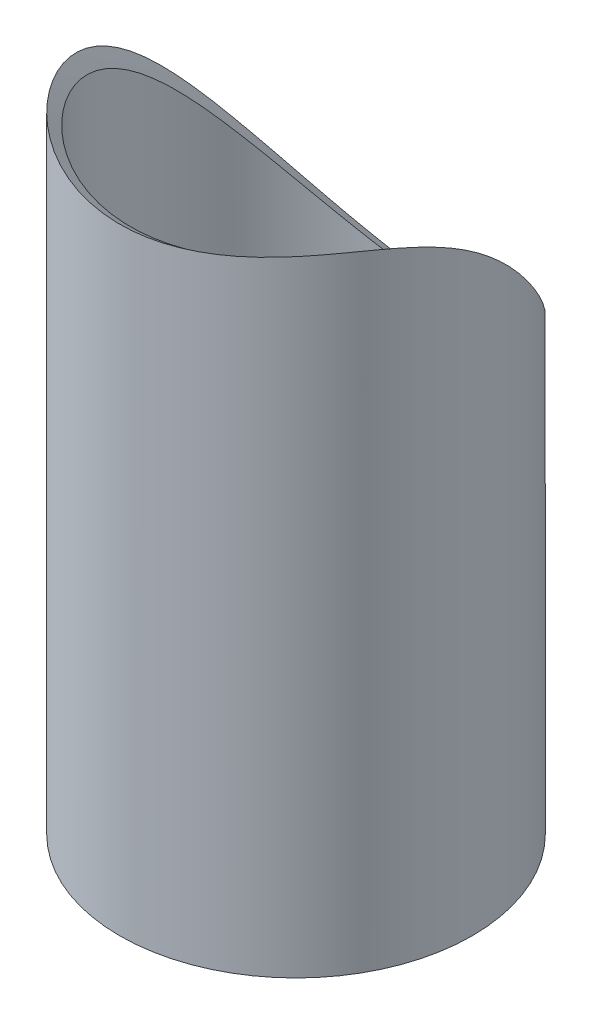
ISO-10303-21;
HEADER;
FILE_DESCRIPTION(('STEP AP214'),'2;1');
FILE_NAME('part.step','',(''),(''),'','','');
FILE_SCHEMA(('AUTOMOTIVE_DESIGN { 1 0 10303 214 1 1 1 1 }'));
ENDSEC;
DATA;
#1=APPLICATION_CONTEXT('core data for automotive mechanical design processes');
#2=APPLICATION_PROTOCOL_DEFINITION('international standard','automotive_design',2000,#1);
#3=PRODUCT_CONTEXT('',#1,'mechanical');
#4=PRODUCT('Part','Part','',(#3));
#5=PRODUCT_RELATED_PRODUCT_CATEGORY('part','',(#4));
#6=PRODUCT_DEFINITION_FORMATION('','',#4);
#7=PRODUCT_DEFINITION_CONTEXT('part definition',#1,'design');
#8=PRODUCT_DEFINITION('design','',#6,#7);
#9=PRODUCT_DEFINITION_SHAPE('','',#8);
#10=(LENGTH_UNIT() NAMED_UNIT(*) SI_UNIT(.MILLI.,.METRE.));
#11=(NAMED_UNIT(*) PLANE_ANGLE_UNIT() SI_UNIT($,.RADIAN.));
#12=(NAMED_UNIT(*) SI_UNIT($,.STERADIAN.) SOLID_ANGLE_UNIT());
#13=UNCERTAINTY_MEASURE_WITH_UNIT(LENGTH_MEASURE(1.E-05),#10,'distance_accuracy_value','');
#14=(GEOMETRIC_REPRESENTATION_CONTEXT(3) GLOBAL_UNCERTAINTY_ASSIGNED_CONTEXT((#13)) GLOBAL_UNIT_ASSIGNED_CONTEXT((#10,
#11,#12)) REPRESENTATION_CONTEXT('',''));
#15=CARTESIAN_POINT('',(0.,0.,0.));
#16=DIRECTION('',(0.,0.,1.));
#17=DIRECTION('',(1.,0.,0.));
#18=AXIS2_PLACEMENT_3D('',#15,#16,#17);
#19=CARTESIAN_POINT('',(0.,0.,0.));
#20=DIRECTION('',(0.,1.,0.));
#21=DIRECTION('',(0.,0.,1.));
#22=AXIS2_PLACEMENT_3D('',#19,#20,#21);
#23=PLANE('',#22);
#24=CARTESIAN_POINT('',(0.,0.,0.));
#25=DIRECTION('',(0.,1.,0.));
#26=DIRECTION('',(0.,0.,1.));
#27=AXIS2_PLACEMENT_3D('',#24,#25,#26);
#28=CIRCLE('',#27,50.);
#29=CARTESIAN_POINT('',(0.,0.,50.));
#30=VERTEX_POINT('',#29);
#31=EDGE_CURVE('E57',#30,#30,#28,.T.);
#32=ORIENTED_EDGE('',*,*,#31,.F.);
#33=EDGE_LOOP('',(#32));
#34=FACE_BOUND('',#33,.T.);
#35=CARTESIAN_POINT('',(0.,0.,0.));
#36=DIRECTION('',(0.,1.,0.));
#37=DIRECTION('',(1.,0.,0.));
#38=AXIS2_PLACEMENT_3D('',#35,#36,#37);
#39=CIRCLE('',#38,47.);
#40=CARTESIAN_POINT('',(47.,0.,0.));
#41=VERTEX_POINT('',#40);
#42=EDGE_CURVE('E91',#41,#41,#39,.T.);
#43=ORIENTED_EDGE('',*,*,#42,.T.);
#44=EDGE_LOOP('',(#43));
#45=FACE_BOUND('',#44,.T.);
#46=ADVANCED_FACE('F78',(#34,#45),#23,.F.);
#47=CARTESIAN_POINT('',(0.,200.,0.));
#48=DIRECTION('',(0.,-1.,0.));
#49=DIRECTION('',(0.,0.,-1.));
#50=AXIS2_PLACEMENT_3D('',#47,#48,#49);
#51=CYLINDRICAL_SURFACE('',#50,50.);
#52=CARTESIAN_POINT('',(0.,104.768313502701,-50.));
#53=CARTESIAN_POINT('',(0.78644238222769,104.768323416378,-49.9999941940866));
#54=CARTESIAN_POINT('',(1.57299880706585,104.798674878486,-49.9813998599408));
#55=CARTESIAN_POINT('',(3.13980000116847,104.919277034445,-49.9074860459622));
#56=CARTESIAN_POINT('',(3.92004367269452,105.009537928725,-49.8521603120879));
#57=CARTESIAN_POINT('',(5.46909188235895,105.247695586177,-49.7060846207518));
#58=CARTESIAN_POINT('',(6.23788401859229,105.395650700994,-49.6152987989814));
#59=CARTESIAN_POINT('',(7.75825219849875,105.745559887175,-49.4003977902167));
#60=CARTESIAN_POINT('',(8.50982691946527,105.947518092258,-49.2762800517964));
#61=CARTESIAN_POINT('',(10.1658076825802,106.45424029591,-48.9645049276828));
#62=CARTESIAN_POINT('',(11.0647236930401,106.772006508497,-48.7687727683172));
#63=CARTESIAN_POINT('',(12.8256737908742,107.474068355606,-48.3355469525679));
#64=CARTESIAN_POINT('',(13.6876984445727,107.858380881737,-48.0980426928306));
#65=CARTESIAN_POINT('',(15.3734294298292,108.685032507887,-47.5860774544873));
#66=CARTESIAN_POINT('',(16.1970809646406,109.127451338698,-47.3115656819318));
#67=CARTESIAN_POINT('',(17.8039756618006,110.061462662947,-46.7305958644128));
#68=CARTESIAN_POINT('',(18.5872167912487,110.553057626608,-46.4241362146058));
#69=CARTESIAN_POINT('',(20.5412788037415,111.864981742934,-45.6039898156328));
#70=CARTESIAN_POINT('',(21.6837223730409,112.715329560634,-45.0703054208032));
#71=CARTESIAN_POINT('',(23.3280852338497,114.049241024074,-44.2287204671817));
#72=CARTESIAN_POINT('',(23.8648598693699,114.503806476247,-43.9412238585591));
#73=CARTESIAN_POINT('',(24.916264956925,115.430193475675,-43.3536892846687));
#74=CARTESIAN_POINT('',(25.4308961117635,115.902014474383,-43.0536517180302));
#75=CARTESIAN_POINT('',(26.4398571644732,116.861736873403,-42.4415233286623));
#76=CARTESIAN_POINT('',(26.9341426893225,117.34966962927,-42.1294087718115));
#77=CARTESIAN_POINT('',(27.9021514252759,118.338827640416,-41.4946359030229));
#78=CARTESIAN_POINT('',(28.3758747001439,118.840052854468,-41.1719776237868));
#79=CARTESIAN_POINT('',(29.7673762288457,120.361036349416,-40.1894724351253));
#80=CARTESIAN_POINT('',(30.6557544971384,121.398360400577,-39.5149309502329));
#81=CARTESIAN_POINT('',(32.267355209026,123.393698816843,-38.2069877615529));
#82=CARTESIAN_POINT('',(32.9980296678332,124.348058584286,-37.5770979461477));
#83=CARTESIAN_POINT('',(34.4061154304464,126.279195666192,-36.2922544512599));
#84=CARTESIAN_POINT('',(35.0835181862315,127.255976546011,-35.6372967743331));
#85=CARTESIAN_POINT('',(36.3888271305669,129.227355675981,-34.3034199457652));
#86=CARTESIAN_POINT('',(37.0166967439963,130.221966438789,-33.624483614076));
#87=CARTESIAN_POINT('',(38.2252724438045,132.223860092923,-32.243916038181));
#88=CARTESIAN_POINT('',(38.805980912297,133.231142341238,-31.5422859427454));
#89=CARTESIAN_POINT('',(39.9235775747383,135.256207694511,-30.1152896076343));
#90=CARTESIAN_POINT('',(40.4603898919546,136.274005694099,-29.3898851822589));
#91=CARTESIAN_POINT('',(41.4909571416998,138.31477915309,-27.9161068200627));
#92=CARTESIAN_POINT('',(41.9847110441677,139.337754735734,-27.1677323343214));
#93=CARTESIAN_POINT('',(42.93022618356,141.384785045508,-25.647544203908));
#94=CARTESIAN_POINT('',(43.3820081177901,142.408838986198,-24.8757423635863));
#95=CARTESIAN_POINT('',(44.244611638993,144.454883271958,-23.3069880488496));
#96=CARTESIAN_POINT('',(44.6554351453077,145.476873711524,-22.5100367552627));
#97=CARTESIAN_POINT('',(45.3330936028251,147.245576357505,-21.1032800347636));
#98=CARTESIAN_POINT('',(45.6092872491557,147.993655379556,-20.4996813447217));
#99=CARTESIAN_POINT('',(46.1394258165705,149.484905204405,-19.2768651466702));
#100=CARTESIAN_POINT('',(46.3933713435424,150.228076140357,-18.6576480645913));
#101=CARTESIAN_POINT('',(46.8786929381629,151.707813934953,-17.4023300919932));
#102=CARTESIAN_POINT('',(47.1100639848603,152.444379291472,-16.7662254852389));
#103=CARTESIAN_POINT('',(47.5495384155535,153.908625715036,-15.4759778110281));
#104=CARTESIAN_POINT('',(47.7576418383881,154.636306796909,-14.821834773684));
#105=CARTESIAN_POINT('',(48.1491354604275,156.078450084046,-13.4958288202867));
#106=CARTESIAN_POINT('',(48.3325897176485,156.792942220841,-12.8240174819972));
#107=CARTESIAN_POINT('',(48.6741832301573,158.207924765098,-11.4594337195789));
#108=CARTESIAN_POINT('',(48.8323215737184,158.908414667489,-10.766660541599));
#109=CARTESIAN_POINT('',(49.12156041996,160.291789736738,-9.35887056857692));
#110=CARTESIAN_POINT('',(49.2526740706821,160.974683322373,-8.64386478592711));
#111=CARTESIAN_POINT('',(49.4858502039919,162.319328035733,-7.18976474370322));
#112=CARTESIAN_POINT('',(49.5879164604444,162.981081900024,-6.45067362723683));
#113=CARTESIAN_POINT('',(49.7776253859829,164.408395103356,-4.79707663528279));
#114=CARTESIAN_POINT('',(49.8583541804008,165.168400819202,-3.87693554055328));
#115=CARTESIAN_POINT('',(49.9689298463217,166.642987363244,-1.99787202324259));
#116=CARTESIAN_POINT('',(49.9987811009452,167.357572099369,-1.03895294868721));
#117=CARTESIAN_POINT('',(50.0011442514139,168.730378993094,0.916758945400916));
#118=CARTESIAN_POINT('',(49.9737355124778,169.388677849226,1.91349746508791));
#119=CARTESIAN_POINT('',(49.8545476273544,170.639409855306,3.94430804836693));
#120=CARTESIAN_POINT('',(49.7627700012893,171.231844560307,4.97837922977168));
#121=CARTESIAN_POINT('',(49.5706476449647,172.067225140827,6.56039036024081));
#122=CARTESIAN_POINT('',(49.4968106054728,172.338531274332,7.09678338322794));
#123=CARTESIAN_POINT('',(49.3299304388253,172.860463778808,8.17656774219508));
#124=CARTESIAN_POINT('',(49.2368898577681,173.111092885078,8.71995814148326));
#125=CARTESIAN_POINT('',(49.0308423822749,173.590781048187,9.81252146609589));
#126=CARTESIAN_POINT('',(48.9178332571782,173.819837690806,10.3616950309983));
#127=CARTESIAN_POINT('',(48.6712616285553,174.25567127206,11.4641740101017));
#128=CARTESIAN_POINT('',(48.5377019420835,174.462451257767,12.0174788481147));
#129=CARTESIAN_POINT('',(48.2495879450917,174.85338864461,13.1265167832008));
#130=CARTESIAN_POINT('',(48.095036701003,175.037549342487,13.6822495141545));
#131=CARTESIAN_POINT('',(47.7646711847235,175.383250170475,14.7943444547096));
#132=CARTESIAN_POINT('',(47.5888595835553,175.54479313665,15.3507065765556));
#133=CARTESIAN_POINT('',(47.2158493607762,175.84561547736,16.4622964564549));
#134=CARTESIAN_POINT('',(47.0186503376748,175.984894433827,17.0175241930137));
#135=CARTESIAN_POINT('',(46.6029676586262,176.241826878212,18.1249379253767));
#136=CARTESIAN_POINT('',(46.3844847182881,176.359481092814,18.6771240227878));
#137=CARTESIAN_POINT('',(45.7692756359582,176.647687036874,20.1539272086032));
#138=CARTESIAN_POINT('',(45.3530625174084,176.799185064727,21.0742683892661));
#139=CARTESIAN_POINT('',(44.4625454879853,177.049087467995,22.8934079021995));
#140=CARTESIAN_POINT('',(43.9882492295746,177.147498828371,23.7922090537551));
#141=CARTESIAN_POINT('',(42.9835833145057,177.29830321309,25.5626320901249));
#142=CARTESIAN_POINT('',(42.4531757586522,177.350664908952,26.4342350832738));
#143=CARTESIAN_POINT('',(41.3392967526718,177.416571931778,28.1443463429662));
#144=CARTESIAN_POINT('',(40.7558204608187,177.430113713335,28.9828515798081));
#145=CARTESIAN_POINT('',(39.4737384061696,177.425313176416,30.7099429819318));
#146=CARTESIAN_POINT('',(38.7694908394659,177.403415776895,31.5943306570423));
#147=CARTESIAN_POINT('',(37.3034164448908,177.329937937142,33.3126241115287));
#148=CARTESIAN_POINT('',(36.5415873747536,177.278356340468,34.1465279227466));
#149=CARTESIAN_POINT('',(34.9639493619514,177.153636567004,35.7602544095779));
#150=CARTESIAN_POINT('',(34.1481266090835,177.080492858524,36.5400631437788));
#151=CARTESIAN_POINT('',(32.4664267259583,176.919821660123,38.0421149151229));
#152=CARTESIAN_POINT('',(31.60054603667,176.832293146649,38.7643538504493));
#153=CARTESIAN_POINT('',(29.65166029704,176.631513961297,40.2812906777648));
#154=CARTESIAN_POINT('',(28.5588937880823,176.51655173702,41.0632643681767));
#155=CARTESIAN_POINT('',(26.3141112161232,176.284119217378,42.5366956908951));
#156=CARTESIAN_POINT('',(25.1620888616301,176.166648656467,43.2281436838854));
#157=CARTESIAN_POINT('',(22.8053152892469,175.936669947439,44.5165321610105));
#158=CARTESIAN_POINT('',(21.6005455719782,175.824163568572,45.1134391435934));
#159=CARTESIAN_POINT('',(19.1460230272705,175.610350898653,46.2086126696836));
#160=CARTESIAN_POINT('',(17.8962702924635,175.509044584539,46.7068794163038));
#161=CARTESIAN_POINT('',(15.2977580704952,175.318082204911,47.6231833684529));
#162=CARTESIAN_POINT('',(13.9471406935507,175.229233501675,48.0361332887338));
#163=CARTESIAN_POINT('',(11.2145492849393,175.073783031109,48.7465581257543));
#164=CARTESIAN_POINT('',(9.83257394881359,175.007182191086,49.0440282292974));
#165=CARTESIAN_POINT('',(7.04757570893721,174.899376356198,49.5209784800099));
#166=CARTESIAN_POINT('',(5.64455523090232,174.858168457173,49.7004721201651));
#167=CARTESIAN_POINT('',(2.82784386673616,174.803016329642,49.9399737516603));
#168=CARTESIAN_POINT('',(1.41415330073316,174.789071286422,49.9999853135583));
#169=CARTESIAN_POINT('',(-1.37943340809569,174.78906345661,50.0000143311629));
#170=CARTESIAN_POINT('',(-2.75933038796572,174.802342785464,49.942863060791));
#171=CARTESIAN_POINT('',(-5.50916269485833,174.854897219719,49.7147107715116));
#172=CARTESIAN_POINT('',(-6.87909816177829,174.89417195933,49.5437113545972));
#173=CARTESIAN_POINT('',(-9.59910853726493,174.997008786971,49.0892887215205));
#174=CARTESIAN_POINT('',(-10.9491853650649,175.060568511755,48.8058764444954));
#175=CARTESIAN_POINT('',(-13.6202173918657,175.2091298246,48.1288668015015));
#176=CARTESIAN_POINT('',(-14.9411724148047,175.294131542253,47.7352687695788));
#177=CARTESIAN_POINT('',(-17.5425925217986,175.481381312846,46.8417105669501));
#178=CARTESIAN_POINT('',(-18.8231262775162,175.583598012754,46.3419433334914));
#179=CARTESIAN_POINT('',(-21.338006577344,175.800206262124,45.2390776687445));
#180=CARTESIAN_POINT('',(-22.5723530008472,175.914597843377,44.6359789676544));
#181=CARTESIAN_POINT('',(-24.3833723874819,176.090405331635,43.6568790885022));
#182=CARTESIAN_POINT('',(-24.980567948466,176.149740202814,43.3179261214076));
#183=CARTESIAN_POINT('',(-26.1604506847544,176.268845546569,42.6157472155857));
#184=CARTESIAN_POINT('',(-26.7431391428147,176.328615980024,42.2525234334852));
#185=CARTESIAN_POINT('',(-27.8931552667303,176.447558965919,41.502329161517));
#186=CARTESIAN_POINT('',(-28.4604814065105,176.506731458597,41.115356324827));
#187=CARTESIAN_POINT('',(-29.5787868298758,176.623319628797,40.3183181752928));
#188=CARTESIAN_POINT('',(-30.1297675605817,176.680735461857,39.9082549161027));
#189=CARTESIAN_POINT('',(-31.2291230242176,176.794060844532,39.054311443404));
#190=CARTESIAN_POINT('',(-31.7770307994846,176.849888590546,38.6098189519979));
#191=CARTESIAN_POINT('',(-32.8537598314302,176.956879089997,37.6978536794471));
#192=CARTESIAN_POINT('',(-33.3825829284271,177.008042293961,37.23038312438));
#193=CARTESIAN_POINT('',(-34.4203947024783,177.10409420591,36.2730604984126));
#194=CARTESIAN_POINT('',(-34.9293787778368,177.14898146435,35.7832032914607));
#195=CARTESIAN_POINT('',(-35.9264023831779,177.230689781474,34.7820734108215));
#196=CARTESIAN_POINT('',(-36.4144442485203,177.267511741445,34.2708031376317));
#197=CARTESIAN_POINT('',(-37.3683283646348,177.331148022042,33.228104008082));
#198=CARTESIAN_POINT('',(-37.834188222086,177.357970399234,32.6966917619015));
#199=CARTESIAN_POINT('',(-38.7431341325572,177.39958146546,31.6143780550348));
#200=CARTESIAN_POINT('',(-39.1862229423699,177.414371614414,31.0634789672349));
#201=CARTESIAN_POINT('',(-40.0486535374694,177.429717382583,29.9433595779552));
#202=CARTESIAN_POINT('',(-40.4680003626026,177.430276034188,29.374143205331));
#203=CARTESIAN_POINT('',(-41.2820431753796,177.414848947607,28.2186547950991));
#204=CARTESIAN_POINT('',(-41.6767410098288,177.398864450482,27.6323840401129));
#205=CARTESIAN_POINT('',(-42.6329227560516,177.335123627867,26.1449953104021));
#206=CARTESIAN_POINT('',(-43.1783522574307,177.275424460424,25.2339433018897));
#207=CARTESIAN_POINT('',(-44.2082385007223,177.104965580981,23.3827591333177));
#208=CARTESIAN_POINT('',(-44.6927051890749,176.994214212235,22.4426317483391));
#209=CARTESIAN_POINT('',(-45.5973775387217,176.714168176494,20.5422605410321));
#210=CARTESIAN_POINT('',(-46.0176902949879,176.544972648762,19.5820533550266));
#211=CARTESIAN_POINT('',(-46.793160034595,176.141735366336,17.6489291879015));
#212=CARTESIAN_POINT('',(-47.1483169981659,175.907693591965,16.6760122029255));
#213=CARTESIAN_POINT('',(-47.794021793311,175.369902175734,14.7238654768347));
#214=CARTESIAN_POINT('',(-48.0843359754994,175.065908211935,13.7446255849555));
#215=CARTESIAN_POINT('',(-48.5997484827701,174.387822982132,11.7933424715593));
#216=CARTESIAN_POINT('',(-48.8248485111266,174.013733547314,10.8212990627295));
#217=CARTESIAN_POINT('',(-49.2126772208008,173.197542483813,8.89274540880944));
#218=CARTESIAN_POINT('',(-49.3753608658865,172.75539206718,7.93624685479127));
#219=CARTESIAN_POINT('',(-49.6422384252747,171.808236110945,6.04642208864099));
#220=CARTESIAN_POINT('',(-49.7464240172465,171.303221640353,5.11309919167857));
#221=CARTESIAN_POINT('',(-49.8747150737341,170.41963228112,3.58907791689429));
#222=CARTESIAN_POINT('',(-49.9140212953309,170.056866624748,2.99034425080735));
#223=CARTESIAN_POINT('',(-49.9709007609087,169.30921800809,1.80573183430042));
#224=CARTESIAN_POINT('',(-49.9884726441845,168.924333664613,1.21985389098409));
#225=CARTESIAN_POINT('',(-50.0033198771675,168.134540903402,0.0613286166561728));
#226=CARTESIAN_POINT('',(-50.0005903443223,167.729627691925,-0.511315498359665));
#227=CARTESIAN_POINT('',(-49.9761980038357,166.901931862121,-1.64316624199244));
#228=CARTESIAN_POINT('',(-49.9545329063462,166.4791470885,-2.2023712370339));
#229=CARTESIAN_POINT('',(-49.86292779519,165.184911897526,-3.86266001684443));
#230=CARTESIAN_POINT('',(-49.7663552572456,164.289450661511,-4.94370242041495));
#231=CARTESIAN_POINT('',(-49.5111540329833,162.44903635806,-7.05530376870747));
#232=CARTESIAN_POINT('',(-49.3524983171061,161.504061889141,-8.08584050424559));
#233=CARTESIAN_POINT('',(-48.9950555979239,159.655098712174,-10.0184594952076));
#234=CARTESIAN_POINT('',(-48.8005899201542,158.754040932135,-10.9241676256017));
#235=CARTESIAN_POINT('',(-48.3688726501585,156.927794075608,-12.6998782571944));
#236=CARTESIAN_POINT('',(-48.1316286309836,156.002609295081,-13.5698870448379));
#237=CARTESIAN_POINT('',(-47.6168367347979,154.133163467761,-15.2785337187769));
#238=CARTESIAN_POINT('',(-47.3392527530153,153.18888599148,-16.1171426471704));
#239=CARTESIAN_POINT('',(-46.7457386783425,151.287044470393,-17.7652183592222));
#240=CARTESIAN_POINT('',(-46.429807098687,150.329479911711,-18.5746840113951));
#241=CARTESIAN_POINT('',(-45.7598095444452,148.402921725172,-20.1690198340202));
#242=CARTESIAN_POINT('',(-45.4056494483697,147.433905371721,-20.9538228605873));
#243=CARTESIAN_POINT('',(-44.6602635008394,145.490556007926,-22.498810254471));
#244=CARTESIAN_POINT('',(-44.2690379766443,144.516223044596,-23.2589948390702));
#245=CARTESIAN_POINT('',(-43.4495702552227,142.566052229054,-24.7560629038938));
#246=CARTESIAN_POINT('',(-43.0213457037965,141.590215309849,-25.4929572652926));
#247=CARTESIAN_POINT('',(-42.1270914489259,139.639726737071,-26.9450408891866));
#248=CARTESIAN_POINT('',(-41.66106230856,138.665075066066,-27.6602304747445));
#249=CARTESIAN_POINT('',(-40.74420611287,136.828404920202,-28.9911671947537));
#250=CARTESIAN_POINT('',(-40.2974710115506,135.965936928981,-29.6091153493789));
#251=CARTESIAN_POINT('',(-39.3722313828537,134.246565343695,-30.8287744250554));
#252=CARTESIAN_POINT('',(-38.8937270981588,133.389661707179,-31.4304854700914));
#253=CARTESIAN_POINT('',(-37.9034431682013,131.683425044086,-32.6178918642646));
#254=CARTESIAN_POINT('',(-37.3916513537433,130.834094916716,-33.2035812438065));
#255=CARTESIAN_POINT('',(-36.3333529807634,129.145858140862,-34.358417956021));
#256=CARTESIAN_POINT('',(-35.7868467810855,128.30695138474,-34.9275654595989));
#257=CARTESIAN_POINT('',(-34.6598340469943,126.646212147566,-36.0461280724785));
#258=CARTESIAN_POINT('',(-34.0794957656972,125.824318807244,-36.5956220143788));
#259=CARTESIAN_POINT('',(-32.8803764538989,124.196790862758,-37.6766844823473));
#260=CARTESIAN_POINT('',(-32.2615933009909,123.39115715949,-38.2082520162575));
#261=CARTESIAN_POINT('',(-30.9836737316862,121.800523961512,-39.25164856663));
#262=CARTESIAN_POINT('',(-30.3245681606621,121.015509335009,-39.7634921945614));
#263=CARTESIAN_POINT('',(-28.9630235638234,119.470038619146,-40.76589044019));
#264=CARTESIAN_POINT('',(-28.2605929859089,118.709577785849,-41.2564491766283));
#265=CARTESIAN_POINT('',(-26.8635344910949,117.27401713313,-42.1781646497744));
#266=CARTESIAN_POINT('',(-26.1722320808751,116.596781018436,-42.6110229585278));
#267=CARTESIAN_POINT('',(-24.7476297009763,115.27291363591,-43.4538808997034));
#268=CARTESIAN_POINT('',(-24.0143332384319,114.626279820539,-43.8638824353821));
#269=CARTESIAN_POINT('',(-22.5022877137141,113.368758919985,-44.6584535969907));
#270=CARTESIAN_POINT('',(-21.7234740177277,112.757925261003,-45.0429853191238));
#271=CARTESIAN_POINT('',(-20.1193562273215,111.580394961251,-45.781997791773));
#272=CARTESIAN_POINT('',(-19.2940514191054,111.013698998464,-46.1364780806883));
#273=CARTESIAN_POINT('',(-17.5837557029372,109.925662388779,-46.8152701405559));
#274=CARTESIAN_POINT('',(-16.6980919833361,109.405066059571,-47.1390912065248));
#275=CARTESIAN_POINT('',(-14.877550632237,108.428877372542,-47.7449369198103));
#276=CARTESIAN_POINT('',(-13.9426662317766,107.973293987611,-48.0269557979221));
#277=CARTESIAN_POINT('',(-12.0289331214401,107.140505111692,-48.5415486283792));
#278=CARTESIAN_POINT('',(-11.0502443591714,106.763038908594,-48.7742871137591));
#279=CARTESIAN_POINT('',(-9.55200883463146,106.263694066847,-49.0817622488374));
#280=CARTESIAN_POINT('',(-9.0476378686035,106.108405701278,-49.1773044611319));
#281=CARTESIAN_POINT('',(-8.0297175129838,105.821489917339,-49.3537258452226));
#282=CARTESIAN_POINT('',(-7.51616966185758,105.689858573134,-49.4346074499359));
#283=CARTESIAN_POINT('',(-6.42890155717328,105.439598192886,-49.5883078914923));
#284=CARTESIAN_POINT('',(-5.85433603867795,105.323619197399,-49.6594909911545));
#285=CARTESIAN_POINT('',(-4.69755077438024,105.123550233367,-49.7822391058446));
#286=CARTESIAN_POINT('',(-4.11533054796343,105.039462277147,-49.833802882894));
#287=CARTESIAN_POINT('',(-2.94555608747954,104.904401800653,-49.9166050356619));
#288=CARTESIAN_POINT('',(-2.35800146779277,104.853431694088,-49.9478419299087));
#289=CARTESIAN_POINT('',(-1.18031901914204,104.785386574612,-49.9895399053955));
#290=CARTESIAN_POINT('',(-0.590191623202278,104.768306062908,-50.0000043570915));
#291=CARTESIAN_POINT('',(0.,104.768313502701,-50.));
#292=B_SPLINE_CURVE_WITH_KNOTS('',3,(#52,#53,#54,#55,#56,#57,#58,#59,#60,#61,#62,#63,#64,#65,
#66,#67,#68,#69,#70,#71,#72,#73,#74,#75,#76,#77,#78,#79,#80,#81,#82,#83,#84,#85,#86,#87,#88,#89,
#90,#91,#92,#93,#94,#95,#96,#97,#98,#99,#100,#101,#102,#103,#104,#105,#106,#107,#108,#109,#110,
#111,#112,#113,#114,#115,#116,#117,#118,#119,#120,#121,#122,#123,#124,#125,#126,#127,#128,#129,
#130,#131,#132,#133,#134,#135,#136,#137,#138,#139,#140,#141,#142,#143,#144,#145,#146,#147,#148,
#149,#150,#151,#152,#153,#154,#155,#156,#157,#158,#159,#160,#161,#162,#163,#164,#165,#166,#167,
#168,#169,#170,#171,#172,#173,#174,#175,#176,#177,#178,#179,#180,#181,#182,#183,#184,#185,#186,
#187,#188,#189,#190,#191,#192,#193,#194,#195,#196,#197,#198,#199,#200,#201,#202,#203,#204,#205,
#206,#207,#208,#209,#210,#211,#212,#213,#214,#215,#216,#217,#218,#219,#220,#221,#222,#223,#224,
#225,#226,#227,#228,#229,#230,#231,#232,#233,#234,#235,#236,#237,#238,#239,#240,#241,#242,#243,
#244,#245,#246,#247,#248,#249,#250,#251,#252,#253,#254,#255,#256,#257,#258,#259,#260,#261,#262,
#263,#264,#265,#266,#267,#268,#269,#270,#271,#272,#273,#274,#275,#276,#277,#278,#279,#280,#281,
#282,#283,#284,#285,#286,#287,#288,#289,#290,#291),.UNSPECIFIED.,.T.,.F.,(4,2,2,2,2,2,2,2,2,2,2,
2,2,2,2,2,2,2,2,2,2,2,2,2,2,2,2,2,2,2,2,2,2,2,2,2,2,2,2,2,2,2,2,2,2,2,2,2,2,2,2,2,2,2,2,2,2,2,2,
2,2,2,2,2,2,2,2,2,2,2,2,2,2,2,2,2,2,2,2,2,2,2,2,2,2,2,2,2,2,2,2,2,2,2,2,2,2,2,2,2,2,2,2,2,2,2,2,
2,2,2,2,2,2,2,2,2,2,2,2,4),(0.,2.3587303320271,4.71786237436033,7.07938664549699,
9.44109173350622,12.3566130533734,15.2728755147709,18.1931821801287,21.1136356125372,
25.6683347268259,27.9475380968185,30.226669074604,32.5105325102672,34.7943888631151,
39.3608836501285,43.430411891413,47.5005918057458,51.5737495330516,55.6467013966706,
59.7265509518799,63.8064980801649,67.8844224969329,71.9621557292702,74.962165609024,
77.9620937634878,80.9626876395703,83.9632765069356,86.9559100799198,89.9486514052894,
92.9399332486346,95.9308262842326,99.5169969502956,103.10285865069,106.683753464918,
110.264563716335,112.08084265589,113.896880938914,115.713122217665,117.529114748964,
119.344842286158,121.160341942876,122.975875686547,124.791348409294,127.851796911554,
130.911842632182,133.973968554497,137.036374130657,140.425439383517,143.814636677104,
147.204704216076,150.595013080004,154.636454900203,158.678326709978,162.721627608316,
166.764920180894,171.005069988022,175.245396505543,179.485237971854,183.724952734418,
187.863421786422,192.001832605957,196.139840806592,200.277874017548,204.408450700742,
208.539038169179,210.606285552056,212.673349489609,214.740618019179,216.807702976113,
218.930274536914,221.052640870158,223.175496595459,225.298114973117,227.41901946322,
229.539666576726,231.659861827441,233.779898033228,236.967100958109,240.153783196045,
243.335086173377,246.516390115999,249.708978735649,252.901483963214,256.096288414266,
259.291547264825,261.394274849224,263.497134070819,265.600499052803,267.70411842661,
271.921219331556,276.140158309781,280.015458704149,283.89007372632,287.768178182214,
291.646433043197,295.534464195502,299.422461022641,303.308613691573,307.194708489034,
310.647801868865,314.100868873782,317.555205418374,321.009506261153,324.447891876206,
327.886467481459,331.322444802057,334.757754250021,337.936844632802,341.115669899844,
344.299124224054,347.482627438419,350.710609761202,353.939037170411,357.156509633635,
358.764783968792,360.372791167143,362.142964749197,363.913250010615,365.683664280199,
367.453791265742),.UNSPECIFIED.);
#293=CARTESIAN_POINT('',(0.,104.768313502701,-50.));
#294=VERTEX_POINT('',#293);
#295=EDGE_CURVE('E96',#294,#294,#292,.T.);
#296=ORIENTED_EDGE('',*,*,#295,.T.);
#297=EDGE_LOOP('',(#296));
#298=FACE_BOUND('',#297,.T.);
#299=ORIENTED_EDGE('',*,*,#31,.T.);
#300=EDGE_LOOP('',(#299));
#301=FACE_BOUND('',#300,.T.);
#302=ADVANCED_FACE('F85',(#298,#301),#51,.T.);
#303=CARTESIAN_POINT('',(0.,200.,0.));
#304=DIRECTION('',(0.,-1.,0.));
#305=DIRECTION('',(0.,0.,-1.));
#306=AXIS2_PLACEMENT_3D('',#303,#304,#305);
#307=CYLINDRICAL_SURFACE('',#306,47.);
#308=CARTESIAN_POINT('',(0.,106.86893611733,-47.));
#309=CARTESIAN_POINT('',(0.756822432063546,106.868926880907,-47.0000055511405));
#310=CARTESIAN_POINT('',(1.51357588815736,106.897810318583,-46.9816837398467));
#311=CARTESIAN_POINT('',(3.02090144860086,107.012521758737,-46.9088829605484));
#312=CARTESIAN_POINT('',(3.77147433279262,107.098342462063,-46.854408627167));
#313=CARTESIAN_POINT('',(5.2614153939408,107.324760255542,-46.7105789678378));
#314=CARTESIAN_POINT('',(6.00077506437492,107.465396962736,-46.6211984141083));
#315=CARTESIAN_POINT('',(7.46305043580241,107.798014161655,-46.4095782298878));
#316=CARTESIAN_POINT('',(8.18596367584725,107.990002283189,-46.2873337164467));
#317=CARTESIAN_POINT('',(9.77803693594605,108.471490637853,-45.9803382562747));
#318=CARTESIAN_POINT('',(10.6419562257521,108.773291274031,-45.7876578279581));
#319=CARTESIAN_POINT('',(12.3344082172446,109.440075213003,-45.3610485660711));
#320=CARTESIAN_POINT('',(13.162932609345,109.805073251992,-45.1271101118313));
#321=CARTESIAN_POINT('',(14.7831447836336,110.590179049222,-44.6226350678894));
#322=CARTESIAN_POINT('',(15.5747815510452,111.010360229168,-44.3520497038598));
#323=CARTESIAN_POINT('',(17.1191903679157,111.897435188332,-43.779126392837));
#324=CARTESIAN_POINT('',(17.871960215342,112.364331609843,-43.4767866497152));
#325=CARTESIAN_POINT('',(19.7420811404161,113.605158463102,-42.6706257536972));
#326=CARTESIAN_POINT('',(20.8327136662726,114.406932831465,-42.147313435855));
#327=CARTESIAN_POINT('',(22.4025773177834,115.66427739443,-41.3215959963942));
#328=CARTESIAN_POINT('',(22.9150421902679,116.0926878605,-41.0394446922924));
#329=CARTESIAN_POINT('',(23.9187913271221,116.965640621943,-40.4626536737849));
#330=CARTESIAN_POINT('',(24.4100762459047,117.41018241811,-40.1680143457897));
#331=CARTESIAN_POINT('',(25.8553413197024,118.766845282479,-39.265687998198));
#332=CARTESIAN_POINT('',(26.778634068785,119.700302285993,-38.64070776546));
#333=CARTESIAN_POINT('',(28.5493282719362,121.61022065976,-37.3515061992811));
#334=CARTESIAN_POINT('',(29.396737410285,122.586677660686,-36.6872888504798));
#335=CARTESIAN_POINT('',(30.9124080174872,124.438901830563,-35.415606147927));
#336=CARTESIAN_POINT('',(31.5894344892698,125.310545720153,-34.8125247962445));
#337=CARTESIAN_POINT('',(32.8945999042015,127.073195920909,-33.5819874718338));
#338=CARTESIAN_POINT('',(33.5227315930761,127.964205080213,-32.9545279028553));
#339=CARTESIAN_POINT('',(34.7332537470968,129.761456593594,-31.6761185857636));
#340=CARTESIAN_POINT('',(35.3156123569963,130.66770903279,-31.0251529307095));
#341=CARTESIAN_POINT('',(36.4364428618711,132.490783469919,-29.7008099836238));
#342=CARTESIAN_POINT('',(36.9749168095711,133.407604971188,-29.027433741935));
#343=CARTESIAN_POINT('',(38.0106308964374,135.249559967711,-27.6573758347799));
#344=CARTESIAN_POINT('',(38.5078101196845,136.174703587046,-26.9606617948396));
#345=CARTESIAN_POINT('',(39.4614666492343,138.028588171896,-25.5444987146977));
#346=CARTESIAN_POINT('',(39.9179429712216,138.95732922384,-24.8250491252535));
#347=CARTESIAN_POINT('',(40.7908618229664,140.814583782859,-23.3630077857675));
#348=CARTESIAN_POINT('',(41.2073233898975,141.743097186408,-22.6204272652618));
#349=CARTESIAN_POINT('',(42.0008180772467,143.596890154532,-21.1106279881868));
#350=CARTESIAN_POINT('',(42.3778531986314,144.522169880916,-20.3434104845766));
#351=CARTESIAN_POINT('',(42.9992986199853,146.125872099482,-18.9858660439374));
#352=CARTESIAN_POINT('',(43.2526848960044,146.80585878597,-18.401477589084));
#353=CARTESIAN_POINT('',(43.7374583931531,148.160450246876,-17.2175478120963));
#354=CARTESIAN_POINT('',(43.9688462842302,148.835055184618,-16.6180069521236));
#355=CARTESIAN_POINT('',(44.4091521597142,150.177251720152,-15.4027580458594));
#356=CARTESIAN_POINT('',(44.6180660402502,150.84484201702,-14.7870470722733));
#357=CARTESIAN_POINT('',(45.0126181012897,152.170917820875,-13.538567842861));
#358=CARTESIAN_POINT('',(45.198256293005,152.829403332247,-12.9057995952515));
#359=CARTESIAN_POINT('',(45.5447663850648,154.133309978049,-11.6238526312345));
#360=CARTESIAN_POINT('',(45.7057030691526,154.778761292514,-10.9747222260235));
#361=CARTESIAN_POINT('',(46.0020868616921,156.055925647218,-9.65732241339582));
#362=CARTESIAN_POINT('',(46.1375331871382,156.687638264908,-8.98905241878088));
#363=CARTESIAN_POINT('',(46.3812232352249,157.934198584363,-7.6326114614076));
#364=CARTESIAN_POINT('',(46.4894787803727,158.54905351187,-6.9444492933712));
#365=CARTESIAN_POINT('',(46.6768304039982,159.758868714487,-5.54710116993069));
#366=CARTESIAN_POINT('',(46.7559298747691,160.353831296732,-4.8379176707271));
#367=CARTESIAN_POINT('',(46.8998709950254,161.679361881119,-3.20135412140616));
#368=CARTESIAN_POINT('',(46.9549509369401,162.402693391741,-2.26718509659864));
#369=CARTESIAN_POINT('',(47.0082435347405,163.802955116317,-0.363040132913221));
#370=CARTESIAN_POINT('',(47.0064620770075,164.479890126038,0.606932089177613));
#371=CARTESIAN_POINT('',(46.9394923135436,165.777437766957,2.58017559321799));
#372=CARTESIAN_POINT('',(46.8743857262593,166.398121859239,3.58340235004945));
#373=CARTESIAN_POINT('',(46.6739151380282,167.574984504198,5.62069486404376));
#374=CARTESIAN_POINT('',(46.5385526942184,168.131164486196,6.65475993723352));
#375=CARTESIAN_POINT('',(46.2770293725411,168.913890917169,8.22949714437386));
#376=CARTESIAN_POINT('',(46.1793387518322,169.167579246023,8.76163041839079));
#377=CARTESIAN_POINT('',(45.9636348721469,169.655528191433,9.83063710795284));
#378=CARTESIAN_POINT('',(45.8456241981625,169.889791273539,10.3675099123323));
#379=CARTESIAN_POINT('',(45.5886601830046,170.338292494517,11.4446802508452));
#380=CARTESIAN_POINT('',(45.4497041751274,170.552528077905,11.9849782126576));
#381=CARTESIAN_POINT('',(45.1504243579259,170.960541192914,13.067301320497));
#382=CARTESIAN_POINT('',(44.9901033264576,171.154321378262,13.6093262330603));
#383=CARTESIAN_POINT('',(44.6477625236948,171.521363193084,14.6935535821155));
#384=CARTESIAN_POINT('',(44.4657401052984,171.69462231428,15.2357560322026));
#385=CARTESIAN_POINT('',(44.0799069665788,172.020743507146,16.3184573889121));
#386=CARTESIAN_POINT('',(43.8760988547999,172.173608015881,16.8589564915269));
#387=CARTESIAN_POINT('',(43.4466987724808,172.459407952804,17.9365750397395));
#388=CARTESIAN_POINT('',(43.2211064840548,172.592343090102,18.4736944358971));
#389=CARTESIAN_POINT('',(42.7483560186772,172.838968644469,19.5427693262813));
#390=CARTESIAN_POINT('',(42.501198482274,172.952659632849,20.0747249733645));
#391=CARTESIAN_POINT('',(41.8005182305178,173.236721855612,21.5113053281885));
#392=CARTESIAN_POINT('',(41.3261747917104,173.389226557803,22.4094447944249));
#393=CARTESIAN_POINT('',(40.3170715387691,173.645782925918,24.1778960664745));
#394=CARTESIAN_POINT('',(39.782318930461,173.749840363241,25.0482111754221));
#395=CARTESIAN_POINT('',(38.6549583847639,173.916229396816,26.7552011400594));
#396=CARTESIAN_POINT('',(38.0623241716306,173.978541940869,27.5918604718776));
#397=CARTESIAN_POINT('',(36.8226246269067,174.068249683515,29.2257815373845));
#398=CARTESIAN_POINT('',(36.1755546868311,174.095641922605,30.0230399263328));
#399=CARTESIAN_POINT('',(34.7670588590246,174.123491482706,31.6466843070395));
#400=CARTESIAN_POINT('',(34.0006015936124,174.121172386891,32.4687543173066));
#401=CARTESIAN_POINT('',(32.4110554406096,174.09102757455,34.0556157284716));
#402=CARTESIAN_POINT('',(31.5879644969059,174.063200931508,34.8204050476589));
#403=CARTESIAN_POINT('',(29.8893969715158,173.989454455042,36.2889053621299));
#404=CARTESIAN_POINT('',(29.0139064102039,173.943529774854,36.9925999342121));
#405=CARTESIAN_POINT('',(27.2152405589745,173.840142901344,38.335237092641));
#406=CARTESIAN_POINT('',(26.2920624532743,173.782680026153,38.9741758487705));
#407=CARTESIAN_POINT('',(24.2673718225975,173.653291607348,40.2708195020847));
#408=CARTESIAN_POINT('',(23.159241003245,173.580473086225,40.9181318589402));
#409=CARTESIAN_POINT('',(20.893733038227,173.434477641521,42.1200249013252));
#410=CARTESIAN_POINT('',(19.7363517431608,173.361300688204,42.6745977539788));
#411=CARTESIAN_POINT('',(17.3795438064553,173.22053055204,43.6874905583574));
#412=CARTESIAN_POINT('',(16.1801076364511,173.152938646394,44.1457885304985));
#413=CARTESIAN_POINT('',(13.7472852728426,173.028135987158,44.9628594990415));
#414=CARTESIAN_POINT('',(12.5138993023556,172.970925165363,45.3216331493432));
#415=CARTESIAN_POINT('',(9.9837663171152,172.869028965709,45.9464145371878));
#416=CARTESIAN_POINT('',(8.68622986505606,172.824772832353,46.2093021390727));
#417=CARTESIAN_POINT('',(6.07309912259405,172.753959639492,46.6247552312529));
#418=CARTESIAN_POINT('',(4.75750433915453,172.727403064214,46.7773177032729));
#419=CARTESIAN_POINT('',(2.11797472800103,172.693598662024,46.9708971470025));
#420=CARTESIAN_POINT('',(0.794040506673285,172.686349447095,47.0119221372071));
#421=CARTESIAN_POINT('',(-1.85251025326779,172.691587388041,46.9821183217312));
#422=CARTESIAN_POINT('',(-3.1751268138389,172.704074209335,46.9112914122615));
#423=CARTESIAN_POINT('',(-5.79013136765278,172.747716874211,46.6602027300968));
#424=CARTESIAN_POINT('',(-7.08267896011184,172.778597923326,46.4815512558421));
#425=CARTESIAN_POINT('',(-9.64794858248634,172.85696547299,46.0175628049444));
#426=CARTESIAN_POINT('',(-10.920670774682,172.90445183754,45.732226702044));
#427=CARTESIAN_POINT('',(-13.4374706357349,173.013074128602,45.0569849205845));
#428=CARTESIAN_POINT('',(-14.6815482257266,173.07421009269,44.6670789541571));
#429=CARTESIAN_POINT('',(-17.1325469151465,173.206012116124,43.7855261537478));
#430=CARTESIAN_POINT('',(-18.3394675954075,173.276678282933,43.293878172497));
#431=CARTESIAN_POINT('',(-20.7165723409608,173.422755422387,42.2083195736291));
#432=CARTESIAN_POINT('',(-21.8864397513338,173.498196171198,41.6137165691053));
#433=CARTESIAN_POINT('',(-23.6007300548444,173.609463431852,40.6501634737262));
#434=CARTESIAN_POINT('',(-24.1654838484878,173.646241843026,40.3169865114795));
#435=CARTESIAN_POINT('',(-25.2806209399239,173.718177490555,39.6272610694871));
#436=CARTESIAN_POINT('',(-25.831005585675,173.753334879216,39.2707147930944));
#437=CARTESIAN_POINT('',(-26.9169399964,173.820993666762,38.5345179182954));
#438=CARTESIAN_POINT('',(-27.4524767566863,173.853492783105,38.1548479425491));
#439=CARTESIAN_POINT('',(-28.5072729320986,173.9146298683,37.3733349746678));
#440=CARTESIAN_POINT('',(-29.0265339306773,173.943268213664,36.9714941500781));
#441=CARTESIAN_POINT('',(-30.0479808066693,173.995422702522,36.1462308456672));
#442=CARTESIAN_POINT('',(-30.550164735572,174.018938263146,35.7228059167613));
#443=CARTESIAN_POINT('',(-31.536444284879,174.05947081739,34.8551862645654));
#444=CARTESIAN_POINT('',(-32.0205417764369,174.076488484947,34.4109937005801));
#445=CARTESIAN_POINT('',(-32.9724655797105,174.102630581954,33.5000437548227));
#446=CARTESIAN_POINT('',(-33.4401855569301,174.111710262706,33.0331739119034));
#447=CARTESIAN_POINT('',(-34.3555189380074,174.120217238001,32.0801308118048));
#448=CARTESIAN_POINT('',(-34.8031346306519,174.119645634108,31.5939597639182));
#449=CARTESIAN_POINT('',(-35.6774849174829,174.107164074066,30.603164511415));
#450=CARTESIAN_POINT('',(-36.1042158052163,174.095252112945,30.0985370588835));
#451=CARTESIAN_POINT('',(-36.9357539777797,174.05832404898,29.0720875289085));
#452=CARTESIAN_POINT('',(-37.3405640749673,174.03330963155,28.5502676710706));
#453=CARTESIAN_POINT('',(-38.126815938987,173.968410923033,27.4914538845949));
#454=CARTESIAN_POINT('',(-38.5082931124189,173.928549847328,26.9544848496434));
#455=CARTESIAN_POINT('',(-39.2476530788219,173.832133005769,25.8660872025179));
#456=CARTESIAN_POINT('',(-39.6055390368526,173.775579485017,25.3146605439486));
#457=CARTESIAN_POINT('',(-40.2969272227909,173.643984299665,24.1989323940749));
#458=CARTESIAN_POINT('',(-40.6304316283552,173.568944288824,23.634632058514));
#459=CARTESIAN_POINT('',(-41.2723446120317,173.398662976227,22.4949164339726));
#460=CARTESIAN_POINT('',(-41.5807541081983,173.303422413936,21.9195015525526));
#461=CARTESIAN_POINT('',(-42.139730633751,173.102721643246,20.8225787175167));
#462=CARTESIAN_POINT('',(-42.392941437507,172.999496401463,20.3020071465231));
#463=CARTESIAN_POINT('',(-42.8785786629461,172.774816519701,19.2551396130706));
#464=CARTESIAN_POINT('',(-43.111005704942,172.653362424072,18.728843821983));
#465=CARTESIAN_POINT('',(-43.5548226853194,172.391469274321,17.6721752493469));
#466=CARTESIAN_POINT('',(-43.7662144807306,172.251031898665,17.1418028321515));
#467=CARTESIAN_POINT('',(-44.167881040093,171.950618644729,16.0785951927819));
#468=CARTESIAN_POINT('',(-44.3581557279778,171.790642696075,15.5457599617436));
#469=CARTESIAN_POINT('',(-44.7175168741163,171.450960938651,14.479638463636));
#470=CARTESIAN_POINT('',(-44.8866164951404,171.271267518259,13.9463526863073));
#471=CARTESIAN_POINT('',(-45.2039823020461,170.892011549574,12.8805742412214));
#472=CARTESIAN_POINT('',(-45.3522459204325,170.692446557795,12.3480816791921));
#473=CARTESIAN_POINT('',(-45.6282456714677,170.273713112718,11.2855839211299));
#474=CARTESIAN_POINT('',(-45.7559848179097,170.054547544921,10.7555783710228));
#475=CARTESIAN_POINT('',(-45.9914641838623,169.597057436219,9.6993868377888));
#476=CARTESIAN_POINT('',(-46.0992023880864,169.358730968135,9.17320124468637));
#477=CARTESIAN_POINT('',(-46.3676874916677,168.680696278971,7.73918136940109));
#478=CARTESIAN_POINT('',(-46.5088348058034,168.222229630462,6.83642709756551));
#479=CARTESIAN_POINT('',(-46.736348640448,167.254261899206,5.05204479545912));
#480=CARTESIAN_POINT('',(-46.8227217719508,166.744766983937,4.17041422801765));
#481=CARTESIAN_POINT('',(-46.9451724222154,165.680219114213,2.43125362932573));
#482=CARTESIAN_POINT('',(-46.9812340654107,165.125151838078,1.57373128891712));
#483=CARTESIAN_POINT('',(-47.0074493284386,163.97553419631,-0.11517241908141));
#484=CARTESIAN_POINT('',(-46.997596351624,163.380978169344,-0.946550013126814));
#485=CARTESIAN_POINT('',(-46.93941552046,162.223561736637,-2.49516993480473));
#486=CARTESIAN_POINT('',(-46.8953061296071,161.664090753721,-3.21512376324938));
#487=CARTESIAN_POINT('',(-46.7764116719739,160.522098300536,-4.63403441590044));
#488=CARTESIAN_POINT('',(-46.7016217049859,159.939573161563,-5.33298786684314));
#489=CARTESIAN_POINT('',(-46.5236239982199,158.754688069289,-6.71083062100683));
#490=CARTESIAN_POINT('',(-46.420398974492,158.152316249079,-7.38970744204613));
#491=CARTESIAN_POINT('',(-46.1875133339881,156.931203643785,-8.72781649520877));
#492=CARTESIAN_POINT('',(-46.0578537815502,156.312463518615,-9.38704951702949));
#493=CARTESIAN_POINT('',(-45.7730076060478,155.058233880716,-10.6901242790527));
#494=CARTESIAN_POINT('',(-45.6176977213064,154.422676584296,-11.3338736075274));
#495=CARTESIAN_POINT('',(-45.2833252010429,153.140226044407,-12.6036290122459));
#496=CARTESIAN_POINT('',(-45.1042625526674,152.493332794802,-13.229635078888));
#497=CARTESIAN_POINT('',(-44.7234555030486,151.190522951899,-14.4647879864558));
#498=CARTESIAN_POINT('',(-44.5217165075283,150.534608541702,-15.0739388024705));
#499=CARTESIAN_POINT('',(-44.0962799980129,149.215504422004,-16.2765108807071));
#500=CARTESIAN_POINT('',(-43.872581486225,148.552314383132,-16.8699314266224));
#501=CARTESIAN_POINT('',(-43.2784977383142,146.864466167191,-18.3551099132817));
#502=CARTESIAN_POINT('',(-42.8936084758231,145.836038413182,-19.2368254652995));
#503=CARTESIAN_POINT('',(-42.0744494224379,143.771656953753,-20.9680142556607));
#504=CARTESIAN_POINT('',(-41.6401748708264,142.735702531793,-21.8174843750145));
#505=CARTESIAN_POINT('',(-40.7219352747279,140.660489260169,-23.4868511008638));
#506=CARTESIAN_POINT('',(-40.2379314924912,139.621228454968,-24.3067239697442));
#507=CARTESIAN_POINT('',(-39.2197222836067,137.544993551284,-25.9175854471204));
#508=CARTESIAN_POINT('',(-38.6855191386551,136.508019351061,-26.708575366157));
#509=CARTESIAN_POINT('',(-37.5677518345984,134.445596130612,-28.2590394977728));
#510=CARTESIAN_POINT('',(-36.9844166257881,133.420116413128,-29.0186377099934));
#511=CARTESIAN_POINT('',(-35.763957970091,131.380856710818,-30.5101283923744));
#512=CARTESIAN_POINT('',(-35.1268302690764,130.367077658548,-31.2420186646369));
#513=CARTESIAN_POINT('',(-33.7964659307779,128.357851451943,-32.6765173169863));
#514=CARTESIAN_POINT('',(-33.1032925069202,127.362385157051,-33.3791573691231));
#515=CARTESIAN_POINT('',(-31.6565272989249,125.395087190501,-34.7542833097015));
#516=CARTESIAN_POINT('',(-30.9029507847261,124.423249625947,-35.4267767526135));
#517=CARTESIAN_POINT('',(-29.4892326026447,122.703441067994,-36.6067361037185));
#518=CARTESIAN_POINT('',(-28.840889825472,121.949842989214,-37.1201356336115));
#519=CARTESIAN_POINT('',(-27.5000767154411,120.467078868846,-38.1241032771083));
#520=CARTESIAN_POINT('',(-26.8076102356092,119.737910702419,-38.6146733777971));
#521=CARTESIAN_POINT('',(-25.375007146619,118.308872877708,-39.5708396266747));
#522=CARTESIAN_POINT('',(-24.6348275462346,117.609030606884,-40.0364125392902));
#523=CARTESIAN_POINT('',(-23.1044062947588,116.246130616723,-40.9386796329593));
#524=CARTESIAN_POINT('',(-22.3141631660355,115.583073984204,-41.3753729608499));
#525=CARTESIAN_POINT('',(-20.6709838869905,114.294304983897,-42.2205435422281));
#526=CARTESIAN_POINT('',(-19.8174044561989,113.669142043278,-42.6286150937632));
#527=CARTESIAN_POINT('',(-18.0538513855835,112.475424786185,-43.4049131436807));
#528=CARTESIAN_POINT('',(-17.1438719928349,111.906876259979,-43.7731355668068));
#529=CARTESIAN_POINT('',(-15.2686347714565,110.84001417118,-44.461944810846));
#530=CARTESIAN_POINT('',(-14.3034845462333,110.341570038482,-44.782620250551));
#531=CARTESIAN_POINT('',(-12.3183755194811,109.428189692492,-45.3687888787181));
#532=CARTESIAN_POINT('',(-11.2984421630349,109.013215127917,-45.6343074116522));
#533=CARTESIAN_POINT('',(-9.44236482398933,108.363509632234,-46.0492547933086));
#534=CARTESIAN_POINT('',(-8.61589250513853,108.109219529053,-46.2113682030867));
#535=CARTESIAN_POINT('',(-6.93811721220165,107.667213867664,-46.4928538251877));
#536=CARTESIAN_POINT('',(-6.0868175956316,107.479489352234,-46.6122317881121));
#537=CARTESIAN_POINT('',(-4.36761755365119,107.176788893648,-46.8046017489379));
#538=CARTESIAN_POINT('',(-3.49974750659045,107.061690943048,-46.877671542164));
#539=CARTESIAN_POINT('',(-1.75455323508387,106.907774976967,-46.9753642310397));
#540=CARTESIAN_POINT('',(-0.877230282766952,106.868946823237,-46.9999935656921));
#541=CARTESIAN_POINT('',(0.,106.86893611733,-47.));
#542=B_SPLINE_CURVE_WITH_KNOTS('',3,(#308,#309,#310,#311,#312,#313,#314,#315,#316,#317,#318,
#319,#320,#321,#322,#323,#324,#325,#326,#327,#328,#329,#330,#331,#332,#333,#334,#335,#336,#337,
#338,#339,#340,#341,#342,#343,#344,#345,#346,#347,#348,#349,#350,#351,#352,#353,#354,#355,#356,
#357,#358,#359,#360,#361,#362,#363,#364,#365,#366,#367,#368,#369,#370,#371,#372,#373,#374,#375,
#376,#377,#378,#379,#380,#381,#382,#383,#384,#385,#386,#387,#388,#389,#390,#391,#392,#393,#394,
#395,#396,#397,#398,#399,#400,#401,#402,#403,#404,#405,#406,#407,#408,#409,#410,#411,#412,#413,
#414,#415,#416,#417,#418,#419,#420,#421,#422,#423,#424,#425,#426,#427,#428,#429,#430,#431,#432,
#433,#434,#435,#436,#437,#438,#439,#440,#441,#442,#443,#444,#445,#446,#447,#448,#449,#450,#451,
#452,#453,#454,#455,#456,#457,#458,#459,#460,#461,#462,#463,#464,#465,#466,#467,#468,#469,#470,
#471,#472,#473,#474,#475,#476,#477,#478,#479,#480,#481,#482,#483,#484,#485,#486,#487,#488,#489,
#490,#491,#492,#493,#494,#495,#496,#497,#498,#499,#500,#501,#502,#503,#504,#505,#506,#507,#508,
#509,#510,#511,#512,#513,#514,#515,#516,#517,#518,#519,#520,#521,#522,#523,#524,#525,#526,#527,
#528,#529,#530,#531,#532,#533,#534,#535,#536,#537,#538,#539,#540,#541),.UNSPECIFIED.,.T.,.F.,(4,
2,2,2,2,2,2,2,2,2,2,2,2,2,2,2,2,2,2,2,2,2,2,2,2,2,2,2,2,2,2,2,2,2,2,2,2,2,2,2,2,2,2,2,2,2,2,2,2,
2,2,2,2,2,2,2,2,2,2,2,2,2,2,2,2,2,2,2,2,2,2,2,2,2,2,2,2,2,2,2,2,2,2,2,2,2,2,2,2,2,2,2,2,2,2,2,2,
2,2,2,2,2,2,2,2,2,2,2,2,2,2,2,2,2,2,2,4),(0.,2.26958599909569,4.53888110162766,6.80981933664736,
9.08109517593239,11.8824110625936,14.6843810342008,17.4901175549209,20.2960128625717,
24.6422721833741,26.8171372605638,28.9919350910715,33.3502729748843,37.7081690155673,
41.4798820217688,45.2521535558039,49.0270275321772,52.8017248356527,56.5818949876116,
60.3621565303861,64.1406106004059,67.918872813584,70.7136629077284,73.5083678609525,
76.3035822786065,79.0987953498127,81.8865474193002,84.6743851081922,87.4610085432281,
90.2473076537324,93.7930102870792,97.3383458649168,100.879112396425,104.419800454437,
106.211885620395,108.003742976531,109.795828660133,111.587681565715,113.379753262814,
115.171610623238,116.963494135304,118.755324441505,121.832890219072,124.910089280242,
127.988691807478,131.067555229519,134.436071382233,137.804709895144,141.17425116376,
144.543991619929,148.395819457124,152.247972459602,156.101003956277,159.954010136963,
163.923087112979,167.892272670909,171.861172874212,175.830005793988,179.740984448801,
183.651931073566,187.562888464814,191.473889959419,195.412294675669,197.382043330569,
199.351606536057,201.322843543821,203.293888172842,205.265156950491,207.236221220286,
209.218326592923,211.20020573637,213.182435340406,215.164410026128,217.143298466179,
219.121920870702,221.100366336618,223.078739391909,224.842142752912,226.605493465747,
228.368688368421,230.131889622117,231.893989341862,233.656306004519,235.418363653376,
237.180598750169,240.244045210508,243.30712185644,246.371164824162,249.435648022769,
252.173073907431,254.910937175707,257.650468311547,260.389889166924,263.142879157032,
265.895870636888,268.648207228493,271.400668938244,275.624069613119,279.847877767406,
284.075001466614,288.301933124501,292.510155313321,296.718710617676,300.922583634336,
305.125397240904,308.4807623105,311.835834779102,315.193973726944,318.552211836928,
321.95111503313,325.350365497609,328.743198521217,332.134469080448,334.770282243271,
337.405740590238,340.036759684925,342.667429024789),.UNSPECIFIED.);
#543=CARTESIAN_POINT('',(0.,106.86893611733,-47.));
#544=VERTEX_POINT('',#543);
#545=EDGE_CURVE('E83',#544,#544,#542,.T.);
#546=ORIENTED_EDGE('',*,*,#545,.F.);
#547=EDGE_LOOP('',(#546));
#548=FACE_BOUND('',#547,.T.);
#549=ORIENTED_EDGE('',*,*,#42,.F.);
#550=EDGE_LOOP('',(#549));
#551=FACE_BOUND('',#550,.T.);
#552=ADVANCED_FACE('F108',(#548,#551),#307,.F.);
#553=CARTESIAN_POINT('',(0.,236.737669159099,24.2760071185446));
#554=DIRECTION('',(0.,-0.573576436351044,-0.819152044288993));
#555=DIRECTION('',(0.,0.819152044288993,-0.573576436351044));
#556=AXIS2_PLACEMENT_3D('',#553,#554,#555);
#557=CYLINDRICAL_SURFACE('',#556,65.5);
#558=ORIENTED_EDGE('',*,*,#545,.T.);
#559=EDGE_LOOP('',(#558));
#560=FACE_BOUND('',#559,.T.);
#561=ORIENTED_EDGE('',*,*,#295,.F.);
#562=EDGE_LOOP('',(#561));
#563=FACE_BOUND('',#562,.T.);
#564=ADVANCED_FACE('F102',(#560,#563),#557,.F.);
#565=CLOSED_SHELL('',(#46,#302,#552,#564));
#566=MANIFOLD_SOLID_BREP('B7',#565);
#567=ADVANCED_BREP_SHAPE_REPRESENTATION('',(#18,#566),#14);
#568=SHAPE_DEFINITION_REPRESENTATION(#9,#567);
ENDSEC;
END-ISO-10303-21;
